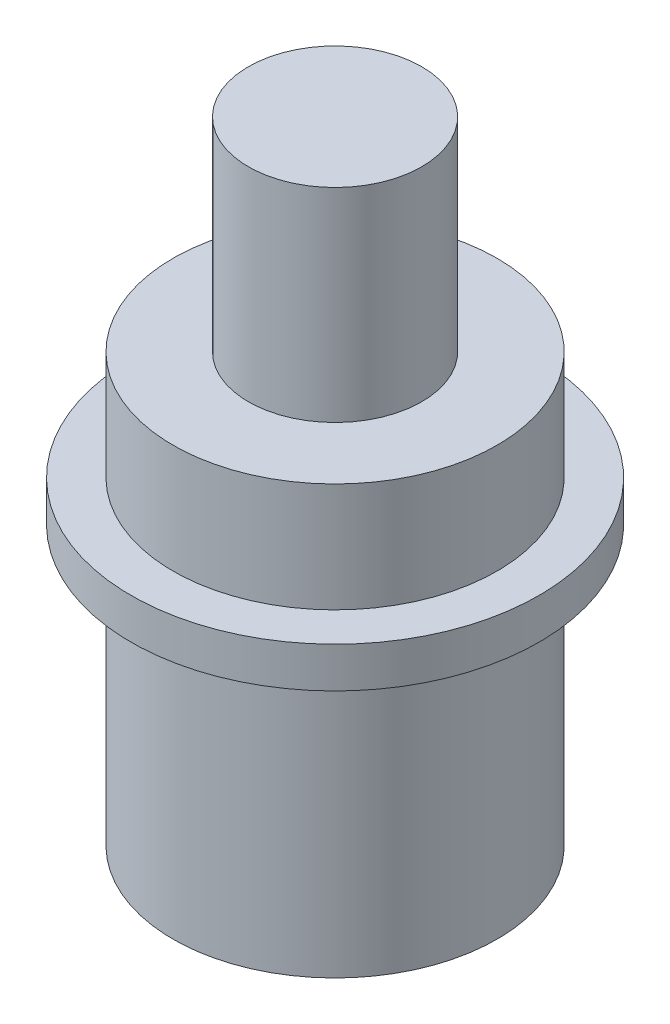
ISO-10303-21;
HEADER;
FILE_DESCRIPTION(('STEP AP214'),'2;1');
FILE_NAME('part.step','',(''),(''),'','','');
FILE_SCHEMA(('AUTOMOTIVE_DESIGN { 1 0 10303 214 1 1 1 1 }'));
ENDSEC;
DATA;
#1=APPLICATION_CONTEXT('core data for automotive mechanical design processes');
#2=APPLICATION_PROTOCOL_DEFINITION('international standard','automotive_design',2000,#1);
#3=PRODUCT_CONTEXT('',#1,'mechanical');
#4=PRODUCT('Part','Part','',(#3));
#5=PRODUCT_RELATED_PRODUCT_CATEGORY('part','',(#4));
#6=PRODUCT_DEFINITION_FORMATION('','',#4);
#7=PRODUCT_DEFINITION_CONTEXT('part definition',#1,'design');
#8=PRODUCT_DEFINITION('design','',#6,#7);
#9=PRODUCT_DEFINITION_SHAPE('','',#8);
#10=(LENGTH_UNIT() NAMED_UNIT(*) SI_UNIT(.MILLI.,.METRE.));
#11=(NAMED_UNIT(*) PLANE_ANGLE_UNIT() SI_UNIT($,.RADIAN.));
#12=(NAMED_UNIT(*) SI_UNIT($,.STERADIAN.) SOLID_ANGLE_UNIT());
#13=UNCERTAINTY_MEASURE_WITH_UNIT(LENGTH_MEASURE(1.E-05),#10,'distance_accuracy_value','');
#14=(GEOMETRIC_REPRESENTATION_CONTEXT(3) GLOBAL_UNCERTAINTY_ASSIGNED_CONTEXT((#13)) GLOBAL_UNIT_ASSIGNED_CONTEXT((#10,
#11,#12)) REPRESENTATION_CONTEXT('',''));
#15=CARTESIAN_POINT('',(0.,0.,0.));
#16=DIRECTION('',(0.,0.,1.));
#17=DIRECTION('',(1.,0.,0.));
#18=AXIS2_PLACEMENT_3D('',#15,#16,#17);
#19=CARTESIAN_POINT('',(0.,0.,0.));
#20=DIRECTION('',(0.,-1.,0.));
#21=DIRECTION('',(0.,0.,-1.));
#22=AXIS2_PLACEMENT_3D('',#19,#20,#21);
#23=PLANE('',#22);
#24=CARTESIAN_POINT('',(0.,0.,0.));
#25=DIRECTION('',(0.,1.,0.));
#26=DIRECTION('',(0.,0.,1.));
#27=AXIS2_PLACEMENT_3D('',#24,#25,#26);
#28=CIRCLE('',#27,2.62);
#29=CARTESIAN_POINT('',(0.,0.,2.62));
#30=VERTEX_POINT('',#29);
#31=EDGE_CURVE('E74',#30,#30,#28,.T.);
#32=ORIENTED_EDGE('',*,*,#31,.T.);
#33=EDGE_LOOP('',(#32));
#34=FACE_BOUND('',#33,.T.);
#35=CARTESIAN_POINT('',(0.,0.,0.));
#36=DIRECTION('',(0.,-1.,0.));
#37=DIRECTION('',(0.,0.,-1.));
#38=AXIS2_PLACEMENT_3D('',#35,#36,#37);
#39=CIRCLE('',#38,3.12);
#40=CARTESIAN_POINT('',(0.,0.,-3.12));
#41=VERTEX_POINT('',#40);
#42=EDGE_CURVE('E10',#41,#41,#39,.T.);
#43=ORIENTED_EDGE('',*,*,#42,.T.);
#44=EDGE_LOOP('',(#43));
#45=FACE_BOUND('',#44,.T.);
#46=ADVANCED_FACE('F37',(#34,#45),#23,.T.);
#47=CARTESIAN_POINT('',(0.,0.,0.));
#48=DIRECTION('',(0.,-1.,0.));
#49=DIRECTION('',(0.,0.,-1.));
#50=AXIS2_PLACEMENT_3D('',#47,#48,#49);
#51=CYLINDRICAL_SURFACE('',#50,3.12);
#52=CARTESIAN_POINT('',(0.,5.36,0.));
#53=DIRECTION('',(0.,-1.,0.));
#54=DIRECTION('',(0.,0.,-1.));
#55=AXIS2_PLACEMENT_3D('',#52,#53,#54);
#56=CIRCLE('',#55,3.12);
#57=CARTESIAN_POINT('',(0.,5.36,-3.12));
#58=VERTEX_POINT('',#57);
#59=EDGE_CURVE('E43',#58,#58,#56,.T.);
#60=ORIENTED_EDGE('',*,*,#59,.T.);
#61=EDGE_LOOP('',(#60));
#62=FACE_BOUND('',#61,.T.);
#63=ORIENTED_EDGE('',*,*,#42,.F.);
#64=EDGE_LOOP('',(#63));
#65=FACE_BOUND('',#64,.T.);
#66=ADVANCED_FACE('F96',(#62,#65),#51,.T.);
#67=CARTESIAN_POINT('',(3.12,5.36,0.));
#68=DIRECTION('',(0.,-1.,0.));
#69=DIRECTION('',(0.,0.,-1.));
#70=AXIS2_PLACEMENT_3D('',#67,#68,#69);
#71=PLANE('',#70);
#72=CARTESIAN_POINT('',(0.,5.36,0.));
#73=DIRECTION('',(0.,-1.,0.));
#74=DIRECTION('',(0.,0.,-1.));
#75=AXIS2_PLACEMENT_3D('',#72,#73,#74);
#76=CIRCLE('',#75,3.93);
#77=CARTESIAN_POINT('',(0.,5.36,-3.93));
#78=VERTEX_POINT('',#77);
#79=EDGE_CURVE('E47',#78,#78,#76,.T.);
#80=ORIENTED_EDGE('',*,*,#79,.T.);
#81=EDGE_LOOP('',(#80));
#82=FACE_BOUND('',#81,.T.);
#83=ORIENTED_EDGE('',*,*,#59,.F.);
#84=EDGE_LOOP('',(#83));
#85=FACE_BOUND('',#84,.T.);
#86=ADVANCED_FACE('F100',(#82,#85),#71,.T.);
#87=CARTESIAN_POINT('',(0.,0.,0.));
#88=DIRECTION('',(0.,-1.,0.));
#89=DIRECTION('',(0.,0.,-1.));
#90=AXIS2_PLACEMENT_3D('',#87,#88,#89);
#91=CYLINDRICAL_SURFACE('',#90,3.93);
#92=CARTESIAN_POINT('',(0.,6.14,0.));
#93=DIRECTION('',(0.,-1.,0.));
#94=DIRECTION('',(0.,0.,-1.));
#95=AXIS2_PLACEMENT_3D('',#92,#93,#94);
#96=CIRCLE('',#95,3.93);
#97=CARTESIAN_POINT('',(0.,6.14,-3.93));
#98=VERTEX_POINT('',#97);
#99=EDGE_CURVE('E51',#98,#98,#96,.T.);
#100=ORIENTED_EDGE('',*,*,#99,.T.);
#101=EDGE_LOOP('',(#100));
#102=FACE_BOUND('',#101,.T.);
#103=ORIENTED_EDGE('',*,*,#79,.F.);
#104=EDGE_LOOP('',(#103));
#105=FACE_BOUND('',#104,.T.);
#106=ADVANCED_FACE('F104',(#102,#105),#91,.T.);
#107=CARTESIAN_POINT('',(3.93,6.14,0.));
#108=DIRECTION('',(0.,1.,0.));
#109=DIRECTION('',(0.,0.,1.));
#110=AXIS2_PLACEMENT_3D('',#107,#108,#109);
#111=PLANE('',#110);
#112=CARTESIAN_POINT('',(0.,6.14,0.));
#113=DIRECTION('',(0.,-1.,0.));
#114=DIRECTION('',(0.,0.,-1.));
#115=AXIS2_PLACEMENT_3D('',#112,#113,#114);
#116=CIRCLE('',#115,3.12);
#117=CARTESIAN_POINT('',(0.,6.14,-3.12));
#118=VERTEX_POINT('',#117);
#119=EDGE_CURVE('E56',#118,#118,#116,.T.);
#120=ORIENTED_EDGE('',*,*,#119,.T.);
#121=EDGE_LOOP('',(#120));
#122=FACE_BOUND('',#121,.T.);
#123=ORIENTED_EDGE('',*,*,#99,.F.);
#124=EDGE_LOOP('',(#123));
#125=FACE_BOUND('',#124,.T.);
#126=ADVANCED_FACE('F111',(#122,#125),#111,.T.);
#127=CARTESIAN_POINT('',(0.,0.,0.));
#128=DIRECTION('',(0.,-1.,0.));
#129=DIRECTION('',(0.,0.,-1.));
#130=AXIS2_PLACEMENT_3D('',#127,#128,#129);
#131=CYLINDRICAL_SURFACE('',#130,3.12);
#132=CARTESIAN_POINT('',(0.,8.24,0.));
#133=DIRECTION('',(0.,-1.,0.));
#134=DIRECTION('',(0.,0.,-1.));
#135=AXIS2_PLACEMENT_3D('',#132,#133,#134);
#136=CIRCLE('',#135,3.12);
#137=CARTESIAN_POINT('',(0.,8.24,-3.12));
#138=VERTEX_POINT('',#137);
#139=EDGE_CURVE('E59',#138,#138,#136,.T.);
#140=ORIENTED_EDGE('',*,*,#139,.T.);
#141=EDGE_LOOP('',(#140));
#142=FACE_BOUND('',#141,.T.);
#143=ORIENTED_EDGE('',*,*,#119,.F.);
#144=EDGE_LOOP('',(#143));
#145=FACE_BOUND('',#144,.T.);
#146=ADVANCED_FACE('F115',(#142,#145),#131,.T.);
#147=CARTESIAN_POINT('',(3.12,8.24,0.));
#148=DIRECTION('',(0.,1.,0.));
#149=DIRECTION('',(0.,0.,1.));
#150=AXIS2_PLACEMENT_3D('',#147,#148,#149);
#151=PLANE('',#150);
#152=CARTESIAN_POINT('',(0.,8.24,0.));
#153=DIRECTION('',(0.,-1.,0.));
#154=DIRECTION('',(0.,0.,-1.));
#155=AXIS2_PLACEMENT_3D('',#152,#153,#154);
#156=CIRCLE('',#155,1.67);
#157=CARTESIAN_POINT('',(0.,8.24,-1.67));
#158=VERTEX_POINT('',#157);
#159=EDGE_CURVE('E62',#158,#158,#156,.T.);
#160=ORIENTED_EDGE('',*,*,#159,.T.);
#161=EDGE_LOOP('',(#160));
#162=FACE_BOUND('',#161,.T.);
#163=ORIENTED_EDGE('',*,*,#139,.F.);
#164=EDGE_LOOP('',(#163));
#165=FACE_BOUND('',#164,.T.);
#166=ADVANCED_FACE('F119',(#162,#165),#151,.T.);
#167=CARTESIAN_POINT('',(0.,0.,0.));
#168=DIRECTION('',(0.,-1.,0.));
#169=DIRECTION('',(0.,0.,-1.));
#170=AXIS2_PLACEMENT_3D('',#167,#168,#169);
#171=CYLINDRICAL_SURFACE('',#170,1.67);
#172=CARTESIAN_POINT('',(0.,12.16,0.));
#173=DIRECTION('',(0.,-1.,0.));
#174=DIRECTION('',(0.,0.,-1.));
#175=AXIS2_PLACEMENT_3D('',#172,#173,#174);
#176=CIRCLE('',#175,1.67);
#177=CARTESIAN_POINT('',(0.,12.16,-1.67));
#178=VERTEX_POINT('',#177);
#179=EDGE_CURVE('E65',#178,#178,#176,.T.);
#180=ORIENTED_EDGE('',*,*,#179,.T.);
#181=EDGE_LOOP('',(#180));
#182=FACE_BOUND('',#181,.T.);
#183=ORIENTED_EDGE('',*,*,#159,.F.);
#184=EDGE_LOOP('',(#183));
#185=FACE_BOUND('',#184,.T.);
#186=ADVANCED_FACE('F92',(#182,#185),#171,.T.);
#187=CARTESIAN_POINT('',(1.67,12.16,0.));
#188=DIRECTION('',(0.,1.,0.));
#189=DIRECTION('',(0.,0.,1.));
#190=AXIS2_PLACEMENT_3D('',#187,#188,#189);
#191=PLANE('',#190);
#192=ORIENTED_EDGE('',*,*,#179,.F.);
#193=EDGE_LOOP('',(#192));
#194=FACE_BOUND('',#193,.T.);
#195=ADVANCED_FACE('F82',(#194),#191,.T.);
#196=CARTESIAN_POINT('',(0.,0.,0.));
#197=DIRECTION('',(0.,-1.,0.));
#198=DIRECTION('',(0.,0.,-1.));
#199=AXIS2_PLACEMENT_3D('',#196,#197,#198);
#200=CONICAL_SURFACE('',#199,2.62,0.785398163397454);
#201=CARTESIAN_POINT('',(0.,0.94999999999999,0.));
#202=DIRECTION('',(0.,1.,0.));
#203=DIRECTION('',(0.,0.,1.));
#204=AXIS2_PLACEMENT_3D('',#201,#202,#203);
#205=CIRCLE('',#204,1.67);
#206=CARTESIAN_POINT('',(0.,0.94999999999999,1.67));
#207=VERTEX_POINT('',#206);
#208=EDGE_CURVE('E71',#207,#207,#205,.T.);
#209=ORIENTED_EDGE('',*,*,#208,.T.);
#210=EDGE_LOOP('',(#209));
#211=FACE_BOUND('',#210,.T.);
#212=ORIENTED_EDGE('',*,*,#31,.F.);
#213=EDGE_LOOP('',(#212));
#214=FACE_BOUND('',#213,.T.);
#215=ADVANCED_FACE('F79',(#211,#214),#200,.F.);
#216=CARTESIAN_POINT('',(0.,4.02,0.));
#217=DIRECTION('',(0.,-1.,0.));
#218=DIRECTION('',(0.,0.,-1.));
#219=AXIS2_PLACEMENT_3D('',#216,#217,#218);
#220=PLANE('',#219);
#221=CARTESIAN_POINT('',(0.,4.02,0.));
#222=DIRECTION('',(0.,-1.,0.));
#223=DIRECTION('',(0.,0.,-1.));
#224=AXIS2_PLACEMENT_3D('',#221,#222,#223);
#225=CIRCLE('',#224,1.67);
#226=CARTESIAN_POINT('',(0.,4.02,-1.67));
#227=VERTEX_POINT('',#226);
#228=EDGE_CURVE('E68',#227,#227,#225,.T.);
#229=ORIENTED_EDGE('',*,*,#228,.T.);
#230=EDGE_LOOP('',(#229));
#231=FACE_BOUND('',#230,.T.);
#232=ADVANCED_FACE('F81',(#231),#220,.T.);
#233=CARTESIAN_POINT('',(0.,4.02,0.));
#234=DIRECTION('',(0.,-1.,0.));
#235=DIRECTION('',(0.,0.,-1.));
#236=AXIS2_PLACEMENT_3D('',#233,#234,#235);
#237=CYLINDRICAL_SURFACE('',#236,1.67);
#238=ORIENTED_EDGE('',*,*,#228,.F.);
#239=EDGE_LOOP('',(#238));
#240=FACE_BOUND('',#239,.T.);
#241=ORIENTED_EDGE('',*,*,#208,.F.);
#242=EDGE_LOOP('',(#241));
#243=FACE_BOUND('',#242,.T.);
#244=ADVANCED_FACE('F89',(#240,#243),#237,.F.);
#245=CLOSED_SHELL('',(#46,#66,#86,#106,#126,#146,#166,#186,#195,#215,#232,#244));
#246=MANIFOLD_SOLID_BREP('B2',#245);
#247=ADVANCED_BREP_SHAPE_REPRESENTATION('',(#18,#246),#14);
#248=SHAPE_DEFINITION_REPRESENTATION(#9,#247);
ENDSEC;
END-ISO-10303-21;
